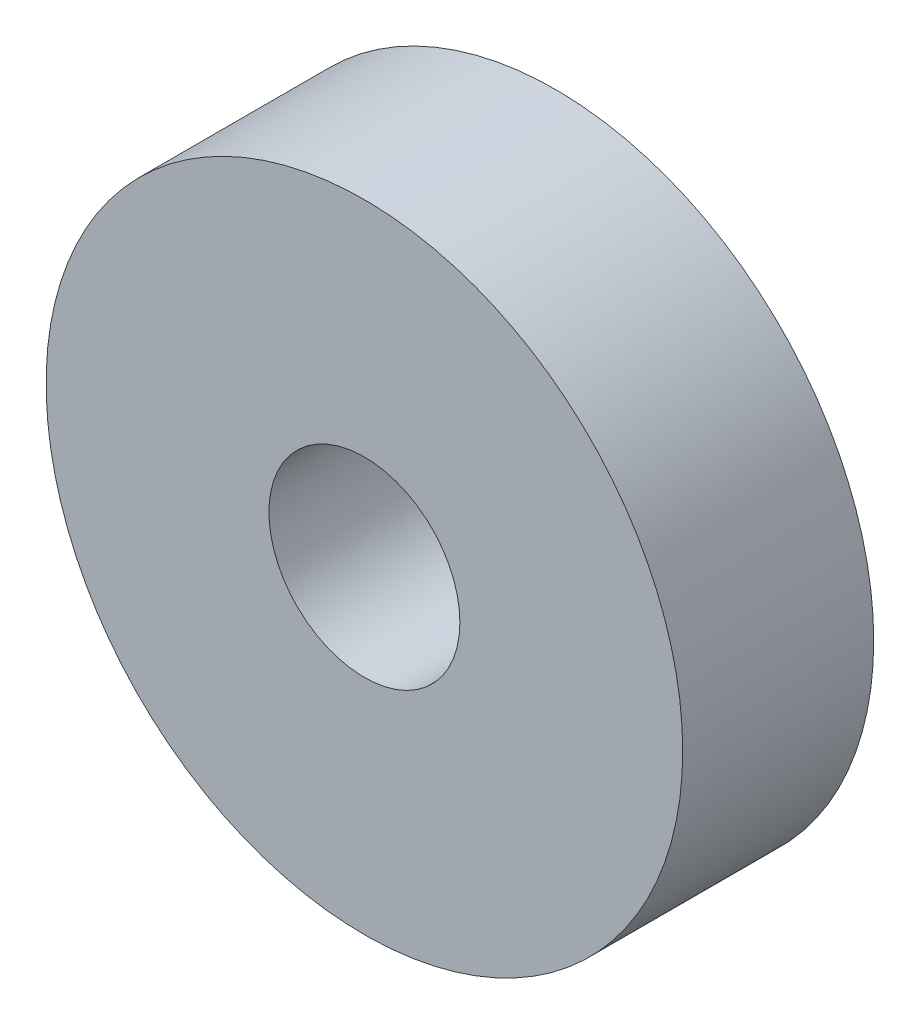
ISO-10303-21;
HEADER;
FILE_DESCRIPTION(('STEP AP214'),'2;1');
FILE_NAME('part.step','',(''),(''),'','','');
FILE_SCHEMA(('AUTOMOTIVE_DESIGN { 1 0 10303 214 1 1 1 1 }'));
ENDSEC;
DATA;
#1=APPLICATION_CONTEXT('core data for automotive mechanical design processes');
#2=APPLICATION_PROTOCOL_DEFINITION('international standard','automotive_design',2000,#1);
#3=PRODUCT_CONTEXT('',#1,'mechanical');
#4=PRODUCT('Part','Part','',(#3));
#5=PRODUCT_RELATED_PRODUCT_CATEGORY('part','',(#4));
#6=PRODUCT_DEFINITION_FORMATION('','',#4);
#7=PRODUCT_DEFINITION_CONTEXT('part definition',#1,'design');
#8=PRODUCT_DEFINITION('design','',#6,#7);
#9=PRODUCT_DEFINITION_SHAPE('','',#8);
#10=(LENGTH_UNIT() NAMED_UNIT(*) SI_UNIT(.MILLI.,.METRE.));
#11=(NAMED_UNIT(*) PLANE_ANGLE_UNIT() SI_UNIT($,.RADIAN.));
#12=(NAMED_UNIT(*) SI_UNIT($,.STERADIAN.) SOLID_ANGLE_UNIT());
#13=UNCERTAINTY_MEASURE_WITH_UNIT(LENGTH_MEASURE(1.E-05),#10,'distance_accuracy_value','');
#14=(GEOMETRIC_REPRESENTATION_CONTEXT(3) GLOBAL_UNCERTAINTY_ASSIGNED_CONTEXT((#13)) GLOBAL_UNIT_ASSIGNED_CONTEXT((#10,
#11,#12)) REPRESENTATION_CONTEXT('',''));
#15=CARTESIAN_POINT('',(0.,0.,0.));
#16=DIRECTION('',(0.,0.,1.));
#17=DIRECTION('',(1.,0.,0.));
#18=AXIS2_PLACEMENT_3D('',#15,#16,#17);
#19=CARTESIAN_POINT('',(0.,0.,3.));
#20=DIRECTION('',(0.,0.,1.));
#21=DIRECTION('',(1.,0.,0.));
#22=AXIS2_PLACEMENT_3D('',#19,#20,#21);
#23=PLANE('',#22);
#24=CARTESIAN_POINT('',(0.,0.,3.));
#25=DIRECTION('',(0.,0.,1.));
#26=DIRECTION('',(1.,0.,0.));
#27=AXIS2_PLACEMENT_3D('',#24,#25,#26);
#28=CIRCLE('',#27,5.);
#29=CARTESIAN_POINT('',(5.,0.,3.));
#30=VERTEX_POINT('',#29);
#31=EDGE_CURVE('E10',#30,#30,#28,.T.);
#32=ORIENTED_EDGE('',*,*,#31,.T.);
#33=EDGE_LOOP('',(#32));
#34=FACE_BOUND('',#33,.T.);
#35=CARTESIAN_POINT('',(0.,0.,3.));
#36=DIRECTION('',(0.,0.,1.));
#37=DIRECTION('',(1.,0.,0.));
#38=AXIS2_PLACEMENT_3D('',#35,#36,#37);
#39=CIRCLE('',#38,1.5);
#40=CARTESIAN_POINT('',(1.5,0.,3.));
#41=VERTEX_POINT('',#40);
#42=EDGE_CURVE('E45',#41,#41,#39,.T.);
#43=ORIENTED_EDGE('',*,*,#42,.F.);
#44=EDGE_LOOP('',(#43));
#45=FACE_BOUND('',#44,.T.);
#46=ADVANCED_FACE('F34',(#34,#45),#23,.T.);
#47=CARTESIAN_POINT('',(0.,0.,0.));
#48=DIRECTION('',(0.,0.,1.));
#49=DIRECTION('',(1.,0.,0.));
#50=AXIS2_PLACEMENT_3D('',#47,#48,#49);
#51=PLANE('',#50);
#52=CARTESIAN_POINT('',(0.,0.,0.));
#53=DIRECTION('',(0.,0.,1.));
#54=DIRECTION('',(1.,0.,0.));
#55=AXIS2_PLACEMENT_3D('',#52,#53,#54);
#56=CIRCLE('',#55,5.);
#57=CARTESIAN_POINT('',(5.,0.,0.));
#58=VERTEX_POINT('',#57);
#59=EDGE_CURVE('E38',#58,#58,#56,.T.);
#60=ORIENTED_EDGE('',*,*,#59,.F.);
#61=EDGE_LOOP('',(#60));
#62=FACE_BOUND('',#61,.T.);
#63=CARTESIAN_POINT('',(0.,0.,0.));
#64=DIRECTION('',(0.,0.,1.));
#65=DIRECTION('',(1.,0.,0.));
#66=AXIS2_PLACEMENT_3D('',#63,#64,#65);
#67=CIRCLE('',#66,1.5);
#68=CARTESIAN_POINT('',(1.5,0.,0.));
#69=VERTEX_POINT('',#68);
#70=EDGE_CURVE('E47',#69,#69,#67,.T.);
#71=ORIENTED_EDGE('',*,*,#70,.T.);
#72=EDGE_LOOP('',(#71));
#73=FACE_BOUND('',#72,.T.);
#74=ADVANCED_FACE('F57',(#62,#73),#51,.F.);
#75=CARTESIAN_POINT('',(0.,0.,3.));
#76=DIRECTION('',(0.,0.,-1.));
#77=DIRECTION('',(-1.,0.,0.));
#78=AXIS2_PLACEMENT_3D('',#75,#76,#77);
#79=CYLINDRICAL_SURFACE('',#78,5.);
#80=ORIENTED_EDGE('',*,*,#31,.F.);
#81=EDGE_LOOP('',(#80));
#82=FACE_BOUND('',#81,.T.);
#83=ORIENTED_EDGE('',*,*,#59,.T.);
#84=EDGE_LOOP('',(#83));
#85=FACE_BOUND('',#84,.T.);
#86=ADVANCED_FACE('F36',(#82,#85),#79,.T.);
#87=CARTESIAN_POINT('',(0.,0.,3.));
#88=DIRECTION('',(0.,0.,-1.));
#89=DIRECTION('',(-1.,0.,0.));
#90=AXIS2_PLACEMENT_3D('',#87,#88,#89);
#91=CYLINDRICAL_SURFACE('',#90,1.5);
#92=ORIENTED_EDGE('',*,*,#42,.T.);
#93=EDGE_LOOP('',(#92));
#94=FACE_BOUND('',#93,.T.);
#95=ORIENTED_EDGE('',*,*,#70,.F.);
#96=EDGE_LOOP('',(#95));
#97=FACE_BOUND('',#96,.T.);
#98=ADVANCED_FACE('F53',(#94,#97),#91,.F.);
#99=CLOSED_SHELL('',(#46,#74,#86,#98));
#100=MANIFOLD_SOLID_BREP('B2',#99);
#101=ADVANCED_BREP_SHAPE_REPRESENTATION('',(#18,#100),#14);
#102=SHAPE_DEFINITION_REPRESENTATION(#9,#101);
ENDSEC;
END-ISO-10303-21;
